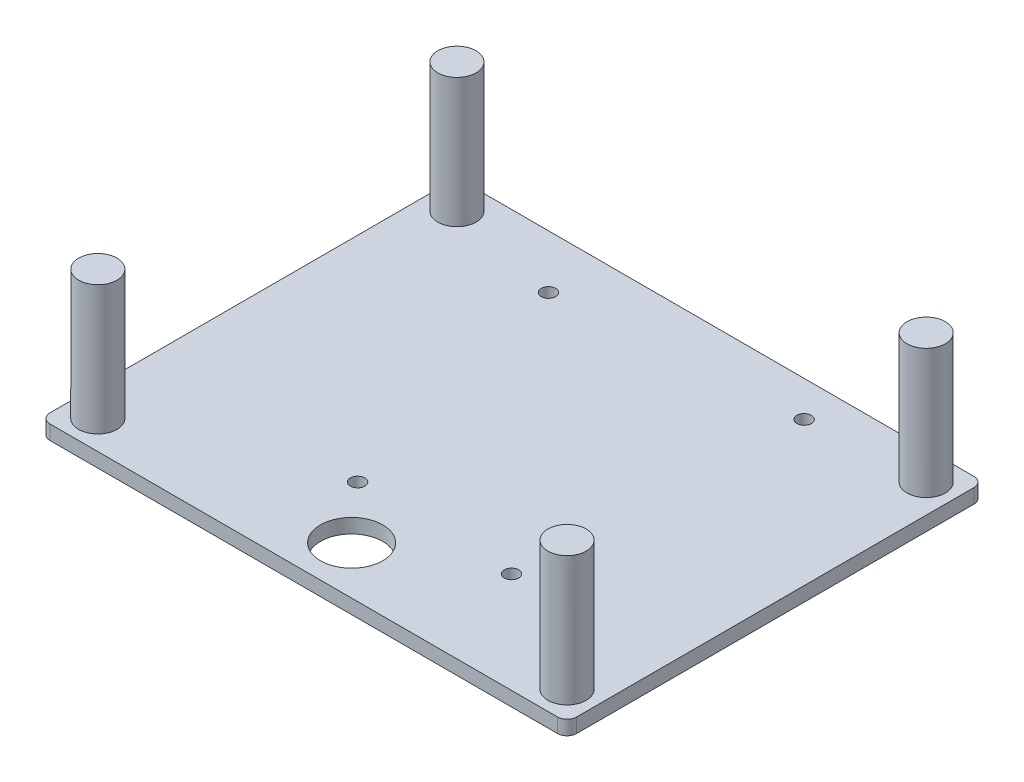
ISO-10303-21;
HEADER;
FILE_DESCRIPTION(('STEP AP214'),'2;1');
FILE_NAME('part.step','',(''),(''),'','','');
FILE_SCHEMA(('AUTOMOTIVE_DESIGN { 1 0 10303 214 1 1 1 1 }'));
ENDSEC;
DATA;
#1=APPLICATION_CONTEXT('core data for automotive mechanical design processes');
#2=APPLICATION_PROTOCOL_DEFINITION('international standard','automotive_design',2000,#1);
#3=PRODUCT_CONTEXT('',#1,'mechanical');
#4=PRODUCT('Part','Part','',(#3));
#5=PRODUCT_RELATED_PRODUCT_CATEGORY('part','',(#4));
#6=PRODUCT_DEFINITION_FORMATION('','',#4);
#7=PRODUCT_DEFINITION_CONTEXT('part definition',#1,'design');
#8=PRODUCT_DEFINITION('design','',#6,#7);
#9=PRODUCT_DEFINITION_SHAPE('','',#8);
#10=(LENGTH_UNIT() NAMED_UNIT(*) SI_UNIT(.MILLI.,.METRE.));
#11=(NAMED_UNIT(*) PLANE_ANGLE_UNIT() SI_UNIT($,.RADIAN.));
#12=(NAMED_UNIT(*) SI_UNIT($,.STERADIAN.) SOLID_ANGLE_UNIT());
#13=UNCERTAINTY_MEASURE_WITH_UNIT(LENGTH_MEASURE(1.E-05),#10,'distance_accuracy_value','');
#14=(GEOMETRIC_REPRESENTATION_CONTEXT(3) GLOBAL_UNCERTAINTY_ASSIGNED_CONTEXT((#13)) GLOBAL_UNIT_ASSIGNED_CONTEXT((#10,
#11,#12)) REPRESENTATION_CONTEXT('',''));
#15=CARTESIAN_POINT('',(0.,0.,0.));
#16=DIRECTION('',(0.,0.,1.));
#17=DIRECTION('',(1.,0.,0.));
#18=AXIS2_PLACEMENT_3D('',#15,#16,#17);
#19=CARTESIAN_POINT('',(55.,3.,43.5));
#20=DIRECTION('',(-1.,0.,0.));
#21=DIRECTION('',(0.,0.,1.));
#22=AXIS2_PLACEMENT_3D('',#19,#20,#21);
#23=PLANE('',#22);
#24=DIRECTION('',(0.,0.,-1.));
#25=VECTOR('',#24,1.);
#26=CARTESIAN_POINT('',(55.,3.,43.5));
#27=LINE('',#26,#25);
#28=CARTESIAN_POINT('',(55.,3.,41.5));
#29=VERTEX_POINT('',#28);
#30=CARTESIAN_POINT('',(55.,3.,-41.5));
#31=VERTEX_POINT('',#30);
#32=EDGE_CURVE('E119',#29,#31,#27,.T.);
#33=ORIENTED_EDGE('',*,*,#32,.F.);
#34=DIRECTION('',(0.,-1.,0.));
#35=VECTOR('',#34,1.);
#36=CARTESIAN_POINT('',(55.,3.,41.5));
#37=LINE('',#36,#35);
#38=CARTESIAN_POINT('',(55.,0.,41.5));
#39=VERTEX_POINT('',#38);
#40=EDGE_CURVE('E104',#29,#39,#37,.T.);
#41=ORIENTED_EDGE('',*,*,#40,.T.);
#42=DIRECTION('',(0.,0.,-1.));
#43=VECTOR('',#42,1.);
#44=CARTESIAN_POINT('',(55.,0.,43.5));
#45=LINE('',#44,#43);
#46=CARTESIAN_POINT('',(55.,0.,-41.5));
#47=VERTEX_POINT('',#46);
#48=EDGE_CURVE('E116',#39,#47,#45,.T.);
#49=ORIENTED_EDGE('',*,*,#48,.T.);
#50=DIRECTION('',(0.,-1.,0.));
#51=VECTOR('',#50,1.);
#52=CARTESIAN_POINT('',(55.,3.,-41.5));
#53=LINE('',#52,#51);
#54=EDGE_CURVE('E121',#47,#31,#53,.F.);
#55=ORIENTED_EDGE('',*,*,#54,.T.);
#56=EDGE_LOOP('',(#33,#41,#49,#55));
#57=FACE_BOUND('',#56,.T.);
#58=ADVANCED_FACE('F33',(#57),#23,.F.);
#59=CARTESIAN_POINT('',(-55.,3.,-43.5));
#60=DIRECTION('',(0.,0.,1.));
#61=DIRECTION('',(1.,0.,0.));
#62=AXIS2_PLACEMENT_3D('',#59,#60,#61);
#63=PLANE('',#62);
#64=DIRECTION('',(-1.,0.,0.));
#65=VECTOR('',#64,1.);
#66=CARTESIAN_POINT('',(-55.,3.,-43.5));
#67=LINE('',#66,#65);
#68=CARTESIAN_POINT('',(53.,3.,-43.5));
#69=VERTEX_POINT('',#68);
#70=CARTESIAN_POINT('',(-53.,3.,-43.5));
#71=VERTEX_POINT('',#70);
#72=EDGE_CURVE('E190',#69,#71,#67,.T.);
#73=ORIENTED_EDGE('',*,*,#72,.F.);
#74=DIRECTION('',(0.,-1.,0.));
#75=VECTOR('',#74,1.);
#76=CARTESIAN_POINT('',(53.,3.,-43.5));
#77=LINE('',#76,#75);
#78=CARTESIAN_POINT('',(53.,0.,-43.5));
#79=VERTEX_POINT('',#78);
#80=EDGE_CURVE('E158',#69,#79,#77,.T.);
#81=ORIENTED_EDGE('',*,*,#80,.T.);
#82=DIRECTION('',(-1.,0.,0.));
#83=VECTOR('',#82,1.);
#84=CARTESIAN_POINT('',(-55.,0.,-43.5));
#85=LINE('',#84,#83);
#86=CARTESIAN_POINT('',(-53.,0.,-43.5));
#87=VERTEX_POINT('',#86);
#88=EDGE_CURVE('E125',#79,#87,#85,.T.);
#89=ORIENTED_EDGE('',*,*,#88,.T.);
#90=DIRECTION('',(0.,-1.,0.));
#91=VECTOR('',#90,1.);
#92=CARTESIAN_POINT('',(-53.,3.,-43.5));
#93=LINE('',#92,#91);
#94=EDGE_CURVE('E156',#87,#71,#93,.F.);
#95=ORIENTED_EDGE('',*,*,#94,.T.);
#96=EDGE_LOOP('',(#73,#81,#89,#95));
#97=FACE_BOUND('',#96,.T.);
#98=ADVANCED_FACE('F270',(#97),#63,.F.);
#99=CARTESIAN_POINT('',(-55.,3.,43.5));
#100=DIRECTION('',(1.,0.,0.));
#101=DIRECTION('',(0.,0.,-1.));
#102=AXIS2_PLACEMENT_3D('',#99,#100,#101);
#103=PLANE('',#102);
#104=DIRECTION('',(0.,0.,1.));
#105=VECTOR('',#104,1.);
#106=CARTESIAN_POINT('',(-55.,3.,43.5));
#107=LINE('',#106,#105);
#108=CARTESIAN_POINT('',(-55.,3.,-41.5));
#109=VERTEX_POINT('',#108);
#110=CARTESIAN_POINT('',(-55.,3.,41.5));
#111=VERTEX_POINT('',#110);
#112=EDGE_CURVE('E189',#109,#111,#107,.T.);
#113=ORIENTED_EDGE('',*,*,#112,.F.);
#114=DIRECTION('',(0.,-1.,0.));
#115=VECTOR('',#114,1.);
#116=CARTESIAN_POINT('',(-55.,3.,-41.5));
#117=LINE('',#116,#115);
#118=CARTESIAN_POINT('',(-55.,0.,-41.5));
#119=VERTEX_POINT('',#118);
#120=EDGE_CURVE('E162',#109,#119,#117,.T.);
#121=ORIENTED_EDGE('',*,*,#120,.T.);
#122=DIRECTION('',(0.,0.,1.));
#123=VECTOR('',#122,1.);
#124=CARTESIAN_POINT('',(-55.,0.,43.5));
#125=LINE('',#124,#123);
#126=CARTESIAN_POINT('',(-55.,0.,41.5));
#127=VERTEX_POINT('',#126);
#128=EDGE_CURVE('E129',#119,#127,#125,.T.);
#129=ORIENTED_EDGE('',*,*,#128,.T.);
#130=DIRECTION('',(0.,-1.,0.));
#131=VECTOR('',#130,1.);
#132=CARTESIAN_POINT('',(-55.,3.,41.5));
#133=LINE('',#132,#131);
#134=EDGE_CURVE('E48',#127,#111,#133,.F.);
#135=ORIENTED_EDGE('',*,*,#134,.T.);
#136=EDGE_LOOP('',(#113,#121,#129,#135));
#137=FACE_BOUND('',#136,.T.);
#138=ADVANCED_FACE('F275',(#137),#103,.F.);
#139=CARTESIAN_POINT('',(-55.,3.,43.5));
#140=DIRECTION('',(0.,0.,-1.));
#141=DIRECTION('',(-1.,0.,0.));
#142=AXIS2_PLACEMENT_3D('',#139,#140,#141);
#143=PLANE('',#142);
#144=DIRECTION('',(1.,0.,0.));
#145=VECTOR('',#144,1.);
#146=CARTESIAN_POINT('',(-55.,0.,43.5));
#147=LINE('',#146,#145);
#148=CARTESIAN_POINT('',(-53.,0.,43.5));
#149=VERTEX_POINT('',#148);
#150=CARTESIAN_POINT('',(53.,0.,43.5));
#151=VERTEX_POINT('',#150);
#152=EDGE_CURVE('E139',#149,#151,#147,.T.);
#153=ORIENTED_EDGE('',*,*,#152,.T.);
#154=DIRECTION('',(0.,-1.,0.));
#155=VECTOR('',#154,1.);
#156=CARTESIAN_POINT('',(53.,3.,43.5));
#157=LINE('',#156,#155);
#158=CARTESIAN_POINT('',(53.,3.,43.5));
#159=VERTEX_POINT('',#158);
#160=EDGE_CURVE('E105',#151,#159,#157,.F.);
#161=ORIENTED_EDGE('',*,*,#160,.T.);
#162=DIRECTION('',(1.,0.,0.));
#163=VECTOR('',#162,1.);
#164=CARTESIAN_POINT('',(-55.,3.,43.5));
#165=LINE('',#164,#163);
#166=CARTESIAN_POINT('',(-53.,3.,43.5));
#167=VERTEX_POINT('',#166);
#168=EDGE_CURVE('E135',#167,#159,#165,.T.);
#169=ORIENTED_EDGE('',*,*,#168,.F.);
#170=DIRECTION('',(0.,-1.,0.));
#171=VECTOR('',#170,1.);
#172=CARTESIAN_POINT('',(-53.,3.,43.5));
#173=LINE('',#172,#171);
#174=EDGE_CURVE('E110',#167,#149,#173,.T.);
#175=ORIENTED_EDGE('',*,*,#174,.T.);
#176=EDGE_LOOP('',(#153,#161,#169,#175));
#177=FACE_BOUND('',#176,.T.);
#178=ADVANCED_FACE('F178',(#177),#143,.F.);
#179=CARTESIAN_POINT('',(0.,3.,0.));
#180=DIRECTION('',(0.,-1.,0.));
#181=DIRECTION('',(0.,0.,-1.));
#182=AXIS2_PLACEMENT_3D('',#179,#180,#181);
#183=PLANE('',#182);
#184=CARTESIAN_POINT('',(-24.72,3.,-32.33));
#185=DIRECTION('',(0.,-1.,0.));
#186=DIRECTION('',(0.,0.,-1.));
#187=AXIS2_PLACEMENT_3D('',#184,#185,#186);
#188=CIRCLE('',#187,1.5);
#189=CARTESIAN_POINT('',(-24.72,3.,-33.83));
#190=VERTEX_POINT('',#189);
#191=EDGE_CURVE('E208',#190,#190,#188,.T.);
#192=ORIENTED_EDGE('',*,*,#191,.T.);
#193=EDGE_LOOP('',(#192));
#194=FACE_BOUND('',#193,.T.);
#195=CARTESIAN_POINT('',(24.94,3.,-36.07));
#196=DIRECTION('',(0.,-1.,0.));
#197=DIRECTION('',(0.,0.,-1.));
#198=AXIS2_PLACEMENT_3D('',#195,#196,#197);
#199=CIRCLE('',#198,1.5);
#200=CARTESIAN_POINT('',(24.94,3.,-37.57));
#201=VERTEX_POINT('',#200);
#202=EDGE_CURVE('E211',#201,#201,#199,.T.);
#203=ORIENTED_EDGE('',*,*,#202,.T.);
#204=EDGE_LOOP('',(#203));
#205=FACE_BOUND('',#204,.T.);
#206=CARTESIAN_POINT('',(-10.36,3.,21.88));
#207=DIRECTION('',(0.,-1.,0.));
#208=DIRECTION('',(0.,0.,-1.));
#209=AXIS2_PLACEMENT_3D('',#206,#207,#208);
#210=CIRCLE('',#209,1.5);
#211=CARTESIAN_POINT('',(-10.36,3.,20.38));
#212=VERTEX_POINT('',#211);
#213=EDGE_CURVE('E214',#212,#212,#210,.T.);
#214=ORIENTED_EDGE('',*,*,#213,.T.);
#215=EDGE_LOOP('',(#214));
#216=FACE_BOUND('',#215,.T.);
#217=CARTESIAN_POINT('',(22.32,3.,22.43));
#218=DIRECTION('',(0.,-1.,0.));
#219=DIRECTION('',(0.,0.,-1.));
#220=AXIS2_PLACEMENT_3D('',#217,#218,#219);
#221=CIRCLE('',#220,1.5);
#222=CARTESIAN_POINT('',(22.32,3.,20.93));
#223=VERTEX_POINT('',#222);
#224=EDGE_CURVE('E217',#223,#223,#221,.T.);
#225=ORIENTED_EDGE('',*,*,#224,.T.);
#226=EDGE_LOOP('',(#225));
#227=FACE_BOUND('',#226,.T.);
#228=CARTESIAN_POINT('',(0.,3.,33.5));
#229=DIRECTION('',(0.,-1.,0.));
#230=DIRECTION('',(0.,0.,-1.));
#231=AXIS2_PLACEMENT_3D('',#228,#229,#230);
#232=CIRCLE('',#231,6.5);
#233=CARTESIAN_POINT('',(0.,3.,27.));
#234=VERTEX_POINT('',#233);
#235=EDGE_CURVE('E202',#234,#234,#232,.T.);
#236=ORIENTED_EDGE('',*,*,#235,.T.);
#237=EDGE_LOOP('',(#236));
#238=FACE_BOUND('',#237,.T.);
#239=CARTESIAN_POINT('',(-49.,3.,37.5));
#240=DIRECTION('',(0.,-1.,0.));
#241=DIRECTION('',(0.,0.,-1.));
#242=AXIS2_PLACEMENT_3D('',#239,#240,#241);
#243=CIRCLE('',#242,4.00000000000001);
#244=CARTESIAN_POINT('',(-49.,3.,33.5));
#245=VERTEX_POINT('',#244);
#246=EDGE_CURVE('E11',#245,#245,#243,.F.);
#247=ORIENTED_EDGE('',*,*,#246,.F.);
#248=EDGE_LOOP('',(#247));
#249=FACE_BOUND('',#248,.T.);
#250=CARTESIAN_POINT('',(49.,3.,37.5));
#251=DIRECTION('',(0.,-1.,0.));
#252=DIRECTION('',(0.,0.,-1.));
#253=AXIS2_PLACEMENT_3D('',#250,#251,#252);
#254=CIRCLE('',#253,4.00000000000001);
#255=CARTESIAN_POINT('',(49.,3.,33.5));
#256=VERTEX_POINT('',#255);
#257=EDGE_CURVE('E41',#256,#256,#254,.F.);
#258=ORIENTED_EDGE('',*,*,#257,.F.);
#259=EDGE_LOOP('',(#258));
#260=FACE_BOUND('',#259,.T.);
#261=CARTESIAN_POINT('',(49.,3.,-37.5));
#262=DIRECTION('',(0.,-1.,0.));
#263=DIRECTION('',(0.,0.,-1.));
#264=AXIS2_PLACEMENT_3D('',#261,#262,#263);
#265=CIRCLE('',#264,4.00000000000001);
#266=CARTESIAN_POINT('',(49.,3.,-41.5));
#267=VERTEX_POINT('',#266);
#268=EDGE_CURVE('E168',#267,#267,#265,.F.);
#269=ORIENTED_EDGE('',*,*,#268,.F.);
#270=EDGE_LOOP('',(#269));
#271=FACE_BOUND('',#270,.T.);
#272=CARTESIAN_POINT('',(-49.,3.,-37.5));
#273=DIRECTION('',(0.,-1.,0.));
#274=DIRECTION('',(0.,0.,-1.));
#275=AXIS2_PLACEMENT_3D('',#272,#273,#274);
#276=CIRCLE('',#275,4.00000000000001);
#277=CARTESIAN_POINT('',(-49.,3.,-41.5));
#278=VERTEX_POINT('',#277);
#279=EDGE_CURVE('E165',#278,#278,#276,.F.);
#280=ORIENTED_EDGE('',*,*,#279,.F.);
#281=EDGE_LOOP('',(#280));
#282=FACE_BOUND('',#281,.T.);
#283=ORIENTED_EDGE('',*,*,#168,.T.);
#284=CARTESIAN_POINT('',(53.,3.,41.5));
#285=DIRECTION('',(0.,-1.,0.));
#286=DIRECTION('',(0.,0.,-1.));
#287=AXIS2_PLACEMENT_3D('',#284,#285,#286);
#288=CIRCLE('',#287,2.);
#289=EDGE_CURVE('E154',#159,#29,#288,.F.);
#290=ORIENTED_EDGE('',*,*,#289,.T.);
#291=ORIENTED_EDGE('',*,*,#32,.T.);
#292=CARTESIAN_POINT('',(53.,3.,-41.5));
#293=DIRECTION('',(0.,-1.,0.));
#294=DIRECTION('',(0.,0.,-1.));
#295=AXIS2_PLACEMENT_3D('',#292,#293,#294);
#296=CIRCLE('',#295,2.);
#297=EDGE_CURVE('E152',#31,#69,#296,.F.);
#298=ORIENTED_EDGE('',*,*,#297,.T.);
#299=ORIENTED_EDGE('',*,*,#72,.T.);
#300=CARTESIAN_POINT('',(-53.,3.,-41.5));
#301=DIRECTION('',(0.,-1.,0.));
#302=DIRECTION('',(0.,0.,-1.));
#303=AXIS2_PLACEMENT_3D('',#300,#301,#302);
#304=CIRCLE('',#303,2.);
#305=EDGE_CURVE('E55',#71,#109,#304,.F.);
#306=ORIENTED_EDGE('',*,*,#305,.T.);
#307=ORIENTED_EDGE('',*,*,#112,.T.);
#308=CARTESIAN_POINT('',(-53.,3.,41.5));
#309=DIRECTION('',(0.,-1.,0.));
#310=DIRECTION('',(0.,0.,-1.));
#311=AXIS2_PLACEMENT_3D('',#308,#309,#310);
#312=CIRCLE('',#311,2.);
#313=EDGE_CURVE('E149',#111,#167,#312,.F.);
#314=ORIENTED_EDGE('',*,*,#313,.T.);
#315=EDGE_LOOP('',(#283,#290,#291,#298,#299,#306,#307,#314));
#316=FACE_BOUND('',#315,.T.);
#317=ADVANCED_FACE('F175',(#194,#205,#216,#227,#238,#249,#260,#271,#282,#316),#183,.F.);
#318=CARTESIAN_POINT('',(0.,0.,0.));
#319=DIRECTION('',(0.,-1.,0.));
#320=DIRECTION('',(0.,0.,-1.));
#321=AXIS2_PLACEMENT_3D('',#318,#319,#320);
#322=PLANE('',#321);
#323=CARTESIAN_POINT('',(-24.72,0.,-32.33));
#324=DIRECTION('',(0.,-1.,0.));
#325=DIRECTION('',(0.,0.,-1.));
#326=AXIS2_PLACEMENT_3D('',#323,#324,#325);
#327=CIRCLE('',#326,1.5);
#328=CARTESIAN_POINT('',(-24.72,0.,-33.83));
#329=VERTEX_POINT('',#328);
#330=EDGE_CURVE('E224',#329,#329,#327,.T.);
#331=ORIENTED_EDGE('',*,*,#330,.F.);
#332=EDGE_LOOP('',(#331));
#333=FACE_BOUND('',#332,.T.);
#334=CARTESIAN_POINT('',(24.94,0.,-36.07));
#335=DIRECTION('',(0.,-1.,0.));
#336=DIRECTION('',(0.,0.,-1.));
#337=AXIS2_PLACEMENT_3D('',#334,#335,#336);
#338=CIRCLE('',#337,1.5);
#339=CARTESIAN_POINT('',(24.94,0.,-37.57));
#340=VERTEX_POINT('',#339);
#341=EDGE_CURVE('E227',#340,#340,#338,.T.);
#342=ORIENTED_EDGE('',*,*,#341,.F.);
#343=EDGE_LOOP('',(#342));
#344=FACE_BOUND('',#343,.T.);
#345=CARTESIAN_POINT('',(-10.36,0.,21.88));
#346=DIRECTION('',(0.,-1.,0.));
#347=DIRECTION('',(0.,0.,-1.));
#348=AXIS2_PLACEMENT_3D('',#345,#346,#347);
#349=CIRCLE('',#348,1.5);
#350=CARTESIAN_POINT('',(-10.36,0.,20.38));
#351=VERTEX_POINT('',#350);
#352=EDGE_CURVE('E223',#351,#351,#349,.T.);
#353=ORIENTED_EDGE('',*,*,#352,.F.);
#354=EDGE_LOOP('',(#353));
#355=FACE_BOUND('',#354,.T.);
#356=CARTESIAN_POINT('',(22.32,0.,22.43));
#357=DIRECTION('',(0.,-1.,0.));
#358=DIRECTION('',(0.,0.,-1.));
#359=AXIS2_PLACEMENT_3D('',#356,#357,#358);
#360=CIRCLE('',#359,1.5);
#361=CARTESIAN_POINT('',(22.32,0.,20.93));
#362=VERTEX_POINT('',#361);
#363=EDGE_CURVE('E220',#362,#362,#360,.T.);
#364=ORIENTED_EDGE('',*,*,#363,.F.);
#365=EDGE_LOOP('',(#364));
#366=FACE_BOUND('',#365,.T.);
#367=CARTESIAN_POINT('',(0.,0.,33.5));
#368=DIRECTION('',(0.,-1.,0.));
#369=DIRECTION('',(0.,0.,-1.));
#370=AXIS2_PLACEMENT_3D('',#367,#368,#369);
#371=CIRCLE('',#370,6.5);
#372=CARTESIAN_POINT('',(0.,0.,27.));
#373=VERTEX_POINT('',#372);
#374=EDGE_CURVE('E205',#373,#373,#371,.T.);
#375=ORIENTED_EDGE('',*,*,#374,.F.);
#376=EDGE_LOOP('',(#375));
#377=FACE_BOUND('',#376,.T.);
#378=ORIENTED_EDGE('',*,*,#48,.F.);
#379=CARTESIAN_POINT('',(53.,0.,41.5));
#380=DIRECTION('',(0.,-1.,0.));
#381=DIRECTION('',(0.,0.,-1.));
#382=AXIS2_PLACEMENT_3D('',#379,#380,#381);
#383=CIRCLE('',#382,2.);
#384=EDGE_CURVE('E100',#39,#151,#383,.T.);
#385=ORIENTED_EDGE('',*,*,#384,.T.);
#386=ORIENTED_EDGE('',*,*,#152,.F.);
#387=CARTESIAN_POINT('',(-53.,0.,41.5));
#388=DIRECTION('',(0.,-1.,0.));
#389=DIRECTION('',(0.,0.,-1.));
#390=AXIS2_PLACEMENT_3D('',#387,#388,#389);
#391=CIRCLE('',#390,2.);
#392=EDGE_CURVE('E120',#149,#127,#391,.T.);
#393=ORIENTED_EDGE('',*,*,#392,.T.);
#394=ORIENTED_EDGE('',*,*,#128,.F.);
#395=CARTESIAN_POINT('',(-53.,0.,-41.5));
#396=DIRECTION('',(0.,-1.,0.));
#397=DIRECTION('',(0.,0.,-1.));
#398=AXIS2_PLACEMENT_3D('',#395,#396,#397);
#399=CIRCLE('',#398,2.);
#400=EDGE_CURVE('E143',#119,#87,#399,.T.);
#401=ORIENTED_EDGE('',*,*,#400,.T.);
#402=ORIENTED_EDGE('',*,*,#88,.F.);
#403=CARTESIAN_POINT('',(53.,0.,-41.5));
#404=DIRECTION('',(0.,-1.,0.));
#405=DIRECTION('',(0.,0.,-1.));
#406=AXIS2_PLACEMENT_3D('',#403,#404,#405);
#407=CIRCLE('',#406,2.);
#408=EDGE_CURVE('E111',#79,#47,#407,.T.);
#409=ORIENTED_EDGE('',*,*,#408,.T.);
#410=EDGE_LOOP('',(#378,#385,#386,#393,#394,#401,#402,#409));
#411=FACE_BOUND('',#410,.T.);
#412=ADVANCED_FACE('F123',(#333,#344,#355,#366,#377,#411),#322,.T.);
#413=CARTESIAN_POINT('',(53.,3.,41.5));
#414=DIRECTION('',(0.,-1.,0.));
#415=DIRECTION('',(0.,0.,-1.));
#416=AXIS2_PLACEMENT_3D('',#413,#414,#415);
#417=CYLINDRICAL_SURFACE('',#416,2.);
#418=ORIENTED_EDGE('',*,*,#289,.F.);
#419=ORIENTED_EDGE('',*,*,#160,.F.);
#420=ORIENTED_EDGE('',*,*,#384,.F.);
#421=ORIENTED_EDGE('',*,*,#40,.F.);
#422=EDGE_LOOP('',(#418,#419,#420,#421));
#423=FACE_BOUND('',#422,.T.);
#424=ADVANCED_FACE('F103',(#423),#417,.T.);
#425=CARTESIAN_POINT('',(53.,3.,-41.5));
#426=DIRECTION('',(0.,-1.,0.));
#427=DIRECTION('',(0.,0.,-1.));
#428=AXIS2_PLACEMENT_3D('',#425,#426,#427);
#429=CYLINDRICAL_SURFACE('',#428,2.);
#430=ORIENTED_EDGE('',*,*,#297,.F.);
#431=ORIENTED_EDGE('',*,*,#54,.F.);
#432=ORIENTED_EDGE('',*,*,#408,.F.);
#433=ORIENTED_EDGE('',*,*,#80,.F.);
#434=EDGE_LOOP('',(#430,#431,#432,#433));
#435=FACE_BOUND('',#434,.T.);
#436=ADVANCED_FACE('F282',(#435),#429,.T.);
#437=CARTESIAN_POINT('',(-53.,3.,-41.5));
#438=DIRECTION('',(0.,-1.,0.));
#439=DIRECTION('',(0.,0.,-1.));
#440=AXIS2_PLACEMENT_3D('',#437,#438,#439);
#441=CYLINDRICAL_SURFACE('',#440,2.);
#442=ORIENTED_EDGE('',*,*,#305,.F.);
#443=ORIENTED_EDGE('',*,*,#94,.F.);
#444=ORIENTED_EDGE('',*,*,#400,.F.);
#445=ORIENTED_EDGE('',*,*,#120,.F.);
#446=EDGE_LOOP('',(#442,#443,#444,#445));
#447=FACE_BOUND('',#446,.T.);
#448=ADVANCED_FACE('F284',(#447),#441,.T.);
#449=CARTESIAN_POINT('',(-53.,3.,41.5));
#450=DIRECTION('',(0.,-1.,0.));
#451=DIRECTION('',(0.,0.,-1.));
#452=AXIS2_PLACEMENT_3D('',#449,#450,#451);
#453=CYLINDRICAL_SURFACE('',#452,2.);
#454=ORIENTED_EDGE('',*,*,#313,.F.);
#455=ORIENTED_EDGE('',*,*,#134,.F.);
#456=ORIENTED_EDGE('',*,*,#392,.F.);
#457=ORIENTED_EDGE('',*,*,#174,.F.);
#458=EDGE_LOOP('',(#454,#455,#456,#457));
#459=FACE_BOUND('',#458,.T.);
#460=ADVANCED_FACE('F35',(#459),#453,.T.);
#461=CARTESIAN_POINT('',(-49.,30.,-37.5));
#462=DIRECTION('',(0.,-1.,0.));
#463=DIRECTION('',(0.,0.,-1.));
#464=AXIS2_PLACEMENT_3D('',#461,#462,#463);
#465=CYLINDRICAL_SURFACE('',#464,4.00000000000001);
#466=CARTESIAN_POINT('',(-49.,30.,-37.5));
#467=DIRECTION('',(0.,1.,0.));
#468=DIRECTION('',(0.,0.,1.));
#469=AXIS2_PLACEMENT_3D('',#466,#467,#468);
#470=CIRCLE('',#469,4.00000000000001);
#471=CARTESIAN_POINT('',(-49.,30.,-33.5));
#472=VERTEX_POINT('',#471);
#473=EDGE_CURVE('E126',#472,#472,#470,.T.);
#474=ORIENTED_EDGE('',*,*,#473,.F.);
#475=EDGE_LOOP('',(#474));
#476=FACE_BOUND('',#475,.T.);
#477=ORIENTED_EDGE('',*,*,#279,.T.);
#478=EDGE_LOOP('',(#477));
#479=FACE_BOUND('',#478,.T.);
#480=ADVANCED_FACE('F291',(#476,#479),#465,.T.);
#481=CARTESIAN_POINT('',(-49.,30.,-37.5));
#482=DIRECTION('',(0.,1.,0.));
#483=DIRECTION('',(0.,0.,1.));
#484=AXIS2_PLACEMENT_3D('',#481,#482,#483);
#485=PLANE('',#484);
#486=ORIENTED_EDGE('',*,*,#473,.T.);
#487=EDGE_LOOP('',(#486));
#488=FACE_BOUND('',#487,.T.);
#489=ADVANCED_FACE('F305',(#488),#485,.T.);
#490=CARTESIAN_POINT('',(49.,30.,-37.5));
#491=DIRECTION('',(0.,-1.,0.));
#492=DIRECTION('',(0.,0.,-1.));
#493=AXIS2_PLACEMENT_3D('',#490,#491,#492);
#494=CYLINDRICAL_SURFACE('',#493,4.00000000000001);
#495=CARTESIAN_POINT('',(49.,30.,-37.5));
#496=DIRECTION('',(0.,1.,0.));
#497=DIRECTION('',(0.,0.,1.));
#498=AXIS2_PLACEMENT_3D('',#495,#496,#497);
#499=CIRCLE('',#498,4.00000000000001);
#500=CARTESIAN_POINT('',(49.,30.,-33.5));
#501=VERTEX_POINT('',#500);
#502=EDGE_CURVE('E132',#501,#501,#499,.T.);
#503=ORIENTED_EDGE('',*,*,#502,.F.);
#504=EDGE_LOOP('',(#503));
#505=FACE_BOUND('',#504,.T.);
#506=ORIENTED_EDGE('',*,*,#268,.T.);
#507=EDGE_LOOP('',(#506));
#508=FACE_BOUND('',#507,.T.);
#509=ADVANCED_FACE('F309',(#505,#508),#494,.T.);
#510=CARTESIAN_POINT('',(49.,30.,-37.5));
#511=DIRECTION('',(0.,1.,0.));
#512=DIRECTION('',(0.,0.,1.));
#513=AXIS2_PLACEMENT_3D('',#510,#511,#512);
#514=PLANE('',#513);
#515=ORIENTED_EDGE('',*,*,#502,.T.);
#516=EDGE_LOOP('',(#515));
#517=FACE_BOUND('',#516,.T.);
#518=ADVANCED_FACE('F313',(#517),#514,.T.);
#519=CARTESIAN_POINT('',(49.,30.,37.5));
#520=DIRECTION('',(0.,-1.,0.));
#521=DIRECTION('',(0.,0.,-1.));
#522=AXIS2_PLACEMENT_3D('',#519,#520,#521);
#523=CYLINDRICAL_SURFACE('',#522,4.00000000000001);
#524=CARTESIAN_POINT('',(49.,30.,37.5));
#525=DIRECTION('',(0.,1.,0.));
#526=DIRECTION('',(0.,0.,1.));
#527=AXIS2_PLACEMENT_3D('',#524,#525,#526);
#528=CIRCLE('',#527,4.00000000000001);
#529=CARTESIAN_POINT('',(49.,30.,41.5));
#530=VERTEX_POINT('',#529);
#531=EDGE_CURVE('E196',#530,#530,#528,.T.);
#532=ORIENTED_EDGE('',*,*,#531,.F.);
#533=EDGE_LOOP('',(#532));
#534=FACE_BOUND('',#533,.T.);
#535=ORIENTED_EDGE('',*,*,#257,.T.);
#536=EDGE_LOOP('',(#535));
#537=FACE_BOUND('',#536,.T.);
#538=ADVANCED_FACE('F173',(#534,#537),#523,.T.);
#539=CARTESIAN_POINT('',(49.,30.,37.5));
#540=DIRECTION('',(0.,1.,0.));
#541=DIRECTION('',(0.,0.,1.));
#542=AXIS2_PLACEMENT_3D('',#539,#540,#541);
#543=PLANE('',#542);
#544=ORIENTED_EDGE('',*,*,#531,.T.);
#545=EDGE_LOOP('',(#544));
#546=FACE_BOUND('',#545,.T.);
#547=ADVANCED_FACE('F257',(#546),#543,.T.);
#548=CARTESIAN_POINT('',(-49.,30.,37.5));
#549=DIRECTION('',(0.,-1.,0.));
#550=DIRECTION('',(0.,0.,-1.));
#551=AXIS2_PLACEMENT_3D('',#548,#549,#550);
#552=CYLINDRICAL_SURFACE('',#551,4.00000000000001);
#553=CARTESIAN_POINT('',(-49.,30.,37.5));
#554=DIRECTION('',(0.,1.,0.));
#555=DIRECTION('',(0.,0.,1.));
#556=AXIS2_PLACEMENT_3D('',#553,#554,#555);
#557=CIRCLE('',#556,4.00000000000001);
#558=CARTESIAN_POINT('',(-49.,30.,41.5));
#559=VERTEX_POINT('',#558);
#560=EDGE_CURVE('E199',#559,#559,#557,.T.);
#561=ORIENTED_EDGE('',*,*,#560,.F.);
#562=EDGE_LOOP('',(#561));
#563=FACE_BOUND('',#562,.T.);
#564=ORIENTED_EDGE('',*,*,#246,.T.);
#565=EDGE_LOOP('',(#564));
#566=FACE_BOUND('',#565,.T.);
#567=ADVANCED_FACE('F255',(#563,#566),#552,.T.);
#568=CARTESIAN_POINT('',(-49.,30.,37.5));
#569=DIRECTION('',(0.,1.,0.));
#570=DIRECTION('',(0.,0.,1.));
#571=AXIS2_PLACEMENT_3D('',#568,#569,#570);
#572=PLANE('',#571);
#573=ORIENTED_EDGE('',*,*,#560,.T.);
#574=EDGE_LOOP('',(#573));
#575=FACE_BOUND('',#574,.T.);
#576=ADVANCED_FACE('F248',(#575),#572,.T.);
#577=CARTESIAN_POINT('',(0.,13.,33.5));
#578=DIRECTION('',(0.,-1.,0.));
#579=DIRECTION('',(0.,0.,-1.));
#580=AXIS2_PLACEMENT_3D('',#577,#578,#579);
#581=CYLINDRICAL_SURFACE('',#580,6.5);
#582=CARTESIAN_POINT('',(0.,0.,27.));
#583=CARTESIAN_POINT('',(0.,0.03125,27.));
#584=CARTESIAN_POINT('',(0.,0.0625000000000001,27.));
#585=CARTESIAN_POINT('',(0.,0.125,27.));
#586=CARTESIAN_POINT('',(0.,0.15625,27.));
#587=CARTESIAN_POINT('',(0.,0.21875,27.));
#588=CARTESIAN_POINT('',(0.,0.25,27.));
#589=CARTESIAN_POINT('',(0.,0.3125,27.));
#590=CARTESIAN_POINT('',(0.,0.34375,27.));
#591=CARTESIAN_POINT('',(0.,0.40625,27.));
#592=CARTESIAN_POINT('',(0.,0.4375,27.));
#593=CARTESIAN_POINT('',(0.,0.5,27.));
#594=CARTESIAN_POINT('',(0.,0.53125,27.));
#595=CARTESIAN_POINT('',(0.,0.593750000000001,27.));
#596=CARTESIAN_POINT('',(0.,0.625000000000001,27.));
#597=CARTESIAN_POINT('',(0.,0.687500000000001,27.));
#598=CARTESIAN_POINT('',(0.,0.718750000000001,27.));
#599=CARTESIAN_POINT('',(0.,0.781250000000001,27.));
#600=CARTESIAN_POINT('',(0.,0.812500000000001,27.));
#601=CARTESIAN_POINT('',(0.,0.875000000000001,27.));
#602=CARTESIAN_POINT('',(0.,0.906250000000001,27.));
#603=CARTESIAN_POINT('',(0.,0.968750000000001,27.));
#604=CARTESIAN_POINT('',(0.,1.,27.));
#605=CARTESIAN_POINT('',(0.,1.0625,27.));
#606=CARTESIAN_POINT('',(0.,1.09375,27.));
#607=CARTESIAN_POINT('',(0.,1.15625,27.));
#608=CARTESIAN_POINT('',(0.,1.1875,27.));
#609=CARTESIAN_POINT('',(0.,1.25,27.));
#610=CARTESIAN_POINT('',(0.,1.28125,27.));
#611=CARTESIAN_POINT('',(0.,1.34375,27.));
#612=CARTESIAN_POINT('',(0.,1.375,27.));
#613=CARTESIAN_POINT('',(0.,1.4375,27.));
#614=CARTESIAN_POINT('',(0.,1.46875,27.));
#615=CARTESIAN_POINT('',(0.,1.53125,27.));
#616=CARTESIAN_POINT('',(0.,1.5625,27.));
#617=CARTESIAN_POINT('',(0.,1.625,27.));
#618=CARTESIAN_POINT('',(0.,1.65625,27.));
#619=CARTESIAN_POINT('',(0.,1.71875,27.));
#620=CARTESIAN_POINT('',(0.,1.75,27.));
#621=CARTESIAN_POINT('',(0.,1.8125,27.));
#622=CARTESIAN_POINT('',(0.,1.84375,27.));
#623=CARTESIAN_POINT('',(0.,1.90625,27.));
#624=CARTESIAN_POINT('',(0.,1.9375,27.));
#625=CARTESIAN_POINT('',(0.,2.,27.));
#626=CARTESIAN_POINT('',(0.,2.03125,27.));
#627=CARTESIAN_POINT('',(0.,2.09375,27.));
#628=CARTESIAN_POINT('',(0.,2.125,27.));
#629=CARTESIAN_POINT('',(0.,2.1875,27.));
#630=CARTESIAN_POINT('',(0.,2.21875,27.));
#631=CARTESIAN_POINT('',(0.,2.28125,27.));
#632=CARTESIAN_POINT('',(0.,2.3125,27.));
#633=CARTESIAN_POINT('',(0.,2.375,27.));
#634=CARTESIAN_POINT('',(0.,2.40625,27.));
#635=CARTESIAN_POINT('',(0.,2.46875,27.));
#636=CARTESIAN_POINT('',(0.,2.5,27.));
#637=CARTESIAN_POINT('',(0.,2.5625,27.));
#638=CARTESIAN_POINT('',(0.,2.59375,27.));
#639=CARTESIAN_POINT('',(0.,2.65625,27.));
#640=CARTESIAN_POINT('',(0.,2.6875,27.));
#641=CARTESIAN_POINT('',(0.,2.75,27.));
#642=CARTESIAN_POINT('',(0.,2.78125,27.));
#643=CARTESIAN_POINT('',(0.,2.84375,27.));
#644=CARTESIAN_POINT('',(0.,2.875,27.));
#645=CARTESIAN_POINT('',(0.,2.9375,27.));
#646=CARTESIAN_POINT('',(0.,2.96875,27.));
#647=CARTESIAN_POINT('',(0.,3.,27.));
#648=B_SPLINE_CURVE_WITH_KNOTS('',3,(#582,#583,#584,#585,#586,#587,#588,#589,#590,#591,#592,
#593,#594,#595,#596,#597,#598,#599,#600,#601,#602,#603,#604,#605,#606,#607,#608,#609,#610,#611,
#612,#613,#614,#615,#616,#617,#618,#619,#620,#621,#622,#623,#624,#625,#626,#627,#628,#629,#630,
#631,#632,#633,#634,#635,#636,#637,#638,#639,#640,#641,#642,#643,#644,#645,#646,#647),
.UNSPECIFIED.,.F.,.F.,(4,2,2,2,2,2,2,2,2,2,2,2,2,2,2,2,2,2,2,2,2,2,2,2,2,2,2,2,2,2,2,2,4),(0.,
0.0937500000000001,0.1875,0.28125,0.375,0.46875,0.5625,0.656250000000001,0.750000000000001,
0.843750000000001,0.937500000000001,1.03125,1.125,1.21875,1.3125,1.40625,1.5,1.59375,1.6875,
1.78125,1.875,1.96875,2.0625,2.15625,2.25,2.34375,2.4375,2.53125,2.625,2.71875,2.8125,2.90625,
3.),.UNSPECIFIED.);
#649=EDGE_CURVE('BSEAM244',#373,#234,#648,.T.);
#650=ORIENTED_EDGE('',*,*,#374,.T.);
#651=ORIENTED_EDGE('',*,*,#235,.F.);
#652=ORIENTED_EDGE('',*,*,#649,.T.);
#653=ORIENTED_EDGE('',*,*,#649,.F.);
#654=EDGE_LOOP('',(#650,#652,#651,#653));
#655=FACE_BOUND('',#654,.T.);
#656=ADVANCED_FACE('F244',(#655),#581,.F.);
#657=CARTESIAN_POINT('',(22.32,10.,22.43));
#658=DIRECTION('',(0.,-1.,0.));
#659=DIRECTION('',(0.,0.,-1.));
#660=AXIS2_PLACEMENT_3D('',#657,#658,#659);
#661=CYLINDRICAL_SURFACE('',#660,1.5);
#662=ORIENTED_EDGE('',*,*,#363,.T.);
#663=EDGE_LOOP('',(#662));
#664=FACE_BOUND('',#663,.T.);
#665=ORIENTED_EDGE('',*,*,#224,.F.);
#666=EDGE_LOOP('',(#665));
#667=FACE_BOUND('',#666,.T.);
#668=ADVANCED_FACE('F247',(#664,#667),#661,.F.);
#669=CARTESIAN_POINT('',(-10.36,10.,21.88));
#670=DIRECTION('',(0.,-1.,0.));
#671=DIRECTION('',(0.,0.,-1.));
#672=AXIS2_PLACEMENT_3D('',#669,#670,#671);
#673=CYLINDRICAL_SURFACE('',#672,1.5);
#674=ORIENTED_EDGE('',*,*,#352,.T.);
#675=EDGE_LOOP('',(#674));
#676=FACE_BOUND('',#675,.T.);
#677=ORIENTED_EDGE('',*,*,#213,.F.);
#678=EDGE_LOOP('',(#677));
#679=FACE_BOUND('',#678,.T.);
#680=ADVANCED_FACE('F233',(#676,#679),#673,.F.);
#681=CARTESIAN_POINT('',(24.94,10.,-36.07));
#682=DIRECTION('',(0.,-1.,0.));
#683=DIRECTION('',(0.,0.,-1.));
#684=AXIS2_PLACEMENT_3D('',#681,#682,#683);
#685=CYLINDRICAL_SURFACE('',#684,1.5);
#686=ORIENTED_EDGE('',*,*,#341,.T.);
#687=EDGE_LOOP('',(#686));
#688=FACE_BOUND('',#687,.T.);
#689=ORIENTED_EDGE('',*,*,#202,.F.);
#690=EDGE_LOOP('',(#689));
#691=FACE_BOUND('',#690,.T.);
#692=ADVANCED_FACE('F370',(#688,#691),#685,.F.);
#693=CARTESIAN_POINT('',(-24.72,10.,-32.33));
#694=DIRECTION('',(0.,-1.,0.));
#695=DIRECTION('',(0.,0.,-1.));
#696=AXIS2_PLACEMENT_3D('',#693,#694,#695);
#697=CYLINDRICAL_SURFACE('',#696,1.5);
#698=ORIENTED_EDGE('',*,*,#330,.T.);
#699=EDGE_LOOP('',(#698));
#700=FACE_BOUND('',#699,.T.);
#701=ORIENTED_EDGE('',*,*,#191,.F.);
#702=EDGE_LOOP('',(#701));
#703=FACE_BOUND('',#702,.T.);
#704=ADVANCED_FACE('F379',(#700,#703),#697,.F.);
#705=CLOSED_SHELL('',(#58,#98,#138,#178,#317,#412,#424,#436,#448,#460,#480,#489,#509,#518,#538,
#547,#567,#576,#656,#668,#680,#692,#704));
#706=MANIFOLD_SOLID_BREP('B2',#705);
#707=ADVANCED_BREP_SHAPE_REPRESENTATION('',(#18,#706),#14);
#708=SHAPE_DEFINITION_REPRESENTATION(#9,#707);
ENDSEC;
END-ISO-10303-21;
